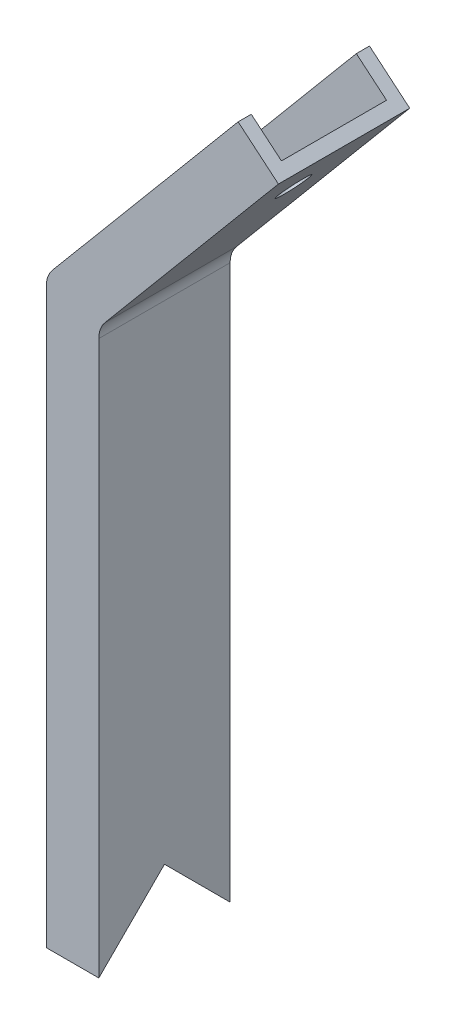
ISO-10303-21;
HEADER;
FILE_DESCRIPTION(('STEP AP214'),'2;1');
FILE_NAME('part.step','',(''),(''),'','','');
FILE_SCHEMA(('AUTOMOTIVE_DESIGN { 1 0 10303 214 1 1 1 1 }'));
ENDSEC;
DATA;
#1=APPLICATION_CONTEXT('core data for automotive mechanical design processes');
#2=APPLICATION_PROTOCOL_DEFINITION('international standard','automotive_design',2000,#1);
#3=PRODUCT_CONTEXT('',#1,'mechanical');
#4=PRODUCT('Part','Part','',(#3));
#5=PRODUCT_RELATED_PRODUCT_CATEGORY('part','',(#4));
#6=PRODUCT_DEFINITION_FORMATION('','',#4);
#7=PRODUCT_DEFINITION_CONTEXT('part definition',#1,'design');
#8=PRODUCT_DEFINITION('design','',#6,#7);
#9=PRODUCT_DEFINITION_SHAPE('','',#8);
#10=(LENGTH_UNIT() NAMED_UNIT(*) SI_UNIT(.MILLI.,.METRE.));
#11=(NAMED_UNIT(*) PLANE_ANGLE_UNIT() SI_UNIT($,.RADIAN.));
#12=(NAMED_UNIT(*) SI_UNIT($,.STERADIAN.) SOLID_ANGLE_UNIT());
#13=UNCERTAINTY_MEASURE_WITH_UNIT(LENGTH_MEASURE(1.E-05),#10,'distance_accuracy_value','');
#14=(GEOMETRIC_REPRESENTATION_CONTEXT(3) GLOBAL_UNCERTAINTY_ASSIGNED_CONTEXT((#13)) GLOBAL_UNIT_ASSIGNED_CONTEXT((#10,
#11,#12)) REPRESENTATION_CONTEXT('',''));
#15=CARTESIAN_POINT('',(0.,0.,0.));
#16=DIRECTION('',(0.,0.,1.));
#17=DIRECTION('',(1.,0.,0.));
#18=AXIS2_PLACEMENT_3D('',#15,#16,#17);
#19=CARTESIAN_POINT('',(-10.,94.6716433746031,50.));
#20=DIRECTION('',(0.766044443118977,-0.64278760968654,0.));
#21=DIRECTION('',(0.64278760968654,0.766044443118977,0.));
#22=AXIS2_PLACEMENT_3D('',#19,#20,#21);
#23=PLANE('',#22);
#24=DIRECTION('',(-0.64278760968654,-0.766044443118977,0.));
#25=VECTOR('',#24,1.);
#26=CARTESIAN_POINT('',(32.8662502431472,145.757651102916,45.));
#27=LINE('',#26,#25);
#28=CARTESIAN_POINT('',(63.0461926343297,181.724705871894,45.));
#29=VERTEX_POINT('',#28);
#30=CARTESIAN_POINT('',(-7.6604444311898,97.4598171288064,45.));
#31=VERTEX_POINT('',#30);
#32=EDGE_CURVE('E287',#29,#31,#27,.T.);
#33=ORIENTED_EDGE('',*,*,#32,.T.);
#34=DIRECTION('',(0.,0.,-1.));
#35=VECTOR('',#34,1.);
#36=CARTESIAN_POINT('',(-7.66044443118978,97.4598171288064,50.));
#37=LINE('',#36,#35);
#38=CARTESIAN_POINT('',(-7.66044443118978,97.4598171288064,50.));
#39=VERTEX_POINT('',#38);
#40=EDGE_CURVE('E230',#31,#39,#37,.F.);
#41=ORIENTED_EDGE('',*,*,#40,.T.);
#42=DIRECTION('',(-0.64278760968654,-0.766044443118977,0.));
#43=VECTOR('',#42,1.);
#44=CARTESIAN_POINT('',(-10.,94.6716433746031,50.));
#45=LINE('',#44,#43);
#46=CARTESIAN_POINT('',(63.0461926343297,181.724705871894,50.));
#47=VERTEX_POINT('',#46);
#48=EDGE_CURVE('E197',#47,#39,#45,.T.);
#49=ORIENTED_EDGE('',*,*,#48,.F.);
#50=DIRECTION('',(0.,0.,-1.));
#51=VECTOR('',#50,1.);
#52=CARTESIAN_POINT('',(63.0461926343297,181.724705871894,50.));
#53=LINE('',#52,#51);
#54=EDGE_CURVE('E210',#47,#29,#53,.T.);
#55=ORIENTED_EDGE('',*,*,#54,.T.);
#56=EDGE_LOOP('',(#33,#41,#49,#55));
#57=FACE_BOUND('',#56,.T.);
#58=ADVANCED_FACE('F42',(#57),#23,.F.);
#59=DIRECTION('',(-0.64278760968654,-0.766044443118977,0.));
#60=VECTOR('',#59,1.);
#61=CARTESIAN_POINT('',(-10.,94.6716433746031,0.));
#62=LINE('',#61,#60);
#63=CARTESIAN_POINT('',(63.0461926343297,181.724705871894,0.));
#64=VERTEX_POINT('',#63);
#65=CARTESIAN_POINT('',(-7.66044443118978,97.4598171288064,0.));
#66=VERTEX_POINT('',#65);
#67=EDGE_CURVE('E190',#64,#66,#62,.T.);
#68=ORIENTED_EDGE('',*,*,#67,.T.);
#69=DIRECTION('',(0.,0.,-1.));
#70=VECTOR('',#69,1.);
#71=CARTESIAN_POINT('',(-7.66044443118978,97.4598171288064,50.));
#72=LINE('',#71,#70);
#73=CARTESIAN_POINT('',(-7.66044443118979,97.4598171288064,5.00000000000001));
#74=VERTEX_POINT('',#73);
#75=EDGE_CURVE('E65',#66,#74,#72,.F.);
#76=ORIENTED_EDGE('',*,*,#75,.T.);
#77=DIRECTION('',(0.64278760968654,0.766044443118977,0.));
#78=VECTOR('',#77,1.);
#79=CARTESIAN_POINT('',(39.0638889106452,153.143709250508,5.00000000000001));
#80=LINE('',#79,#78);
#81=CARTESIAN_POINT('',(63.0461926343297,181.724705871894,5.));
#82=VERTEX_POINT('',#81);
#83=EDGE_CURVE('E264',#74,#82,#80,.T.);
#84=ORIENTED_EDGE('',*,*,#83,.T.);
#85=EDGE_CURVE('E201',#82,#64,#53,.T.);
#86=ORIENTED_EDGE('',*,*,#85,.T.);
#87=EDGE_LOOP('',(#68,#76,#84,#86));
#88=FACE_BOUND('',#87,.T.);
#89=ADVANCED_FACE('F354',(#88),#23,.F.);
#90=CARTESIAN_POINT('',(78.3670814967092,168.868953678163,50.));
#91=DIRECTION('',(-0.642787609686541,-0.766044443118977,0.));
#92=DIRECTION('',(0.766044443118977,-0.642787609686541,0.));
#93=AXIS2_PLACEMENT_3D('',#90,#91,#92);
#94=PLANE('',#93);
#95=DIRECTION('',(-0.766044443118977,0.642787609686541,0.));
#96=VECTOR('',#95,1.);
#97=CARTESIAN_POINT('',(74.5368592811144,172.082891726596,45.));
#98=LINE('',#97,#96);
#99=CARTESIAN_POINT('',(74.5368592811144,172.082891726596,45.));
#100=VERTEX_POINT('',#99);
#101=EDGE_CURVE('E295',#100,#29,#98,.T.);
#102=ORIENTED_EDGE('',*,*,#101,.T.);
#103=ORIENTED_EDGE('',*,*,#54,.F.);
#104=DIRECTION('',(-0.766044443118977,0.642787609686541,0.));
#105=VECTOR('',#104,1.);
#106=CARTESIAN_POINT('',(78.3670814967092,168.868953678163,50.));
#107=LINE('',#106,#105);
#108=CARTESIAN_POINT('',(78.3670814967092,168.868953678163,50.));
#109=VERTEX_POINT('',#108);
#110=EDGE_CURVE('E187',#109,#47,#107,.T.);
#111=ORIENTED_EDGE('',*,*,#110,.F.);
#112=DIRECTION('',(0.,0.,-1.));
#113=VECTOR('',#112,1.);
#114=CARTESIAN_POINT('',(78.3670814967092,168.868953678163,50.));
#115=LINE('',#114,#113);
#116=CARTESIAN_POINT('',(78.3670814967092,168.868953678163,0.));
#117=VERTEX_POINT('',#116);
#118=EDGE_CURVE('E213',#109,#117,#115,.T.);
#119=ORIENTED_EDGE('',*,*,#118,.T.);
#120=DIRECTION('',(-0.766044443118977,0.642787609686541,0.));
#121=VECTOR('',#120,1.);
#122=CARTESIAN_POINT('',(78.3670814967092,168.868953678163,0.));
#123=LINE('',#122,#121);
#124=EDGE_CURVE('E206',#117,#64,#123,.T.);
#125=ORIENTED_EDGE('',*,*,#124,.T.);
#126=ORIENTED_EDGE('',*,*,#85,.F.);
#127=DIRECTION('',(0.766044443118977,-0.642787609686541,0.));
#128=VECTOR('',#127,1.);
#129=CARTESIAN_POINT('',(63.0461926343297,181.724705871894,5.));
#130=LINE('',#129,#128);
#131=CARTESIAN_POINT('',(74.5368592811144,172.082891726596,5.));
#132=VERTEX_POINT('',#131);
#133=EDGE_CURVE('E293',#82,#132,#130,.T.);
#134=ORIENTED_EDGE('',*,*,#133,.T.);
#135=DIRECTION('',(0.,0.,1.));
#136=VECTOR('',#135,1.);
#137=CARTESIAN_POINT('',(74.5368592811144,172.082891726596,5.));
#138=LINE('',#137,#136);
#139=EDGE_CURVE('E262',#132,#100,#138,.T.);
#140=ORIENTED_EDGE('',*,*,#139,.T.);
#141=EDGE_LOOP('',(#102,#103,#111,#119,#125,#126,#134,#140));
#142=FACE_BOUND('',#141,.T.);
#143=ADVANCED_FACE('F334',(#142),#94,.F.);
#144=CARTESIAN_POINT('',(5.,181.726705871894,45.));
#145=DIRECTION('',(-1.,0.,0.));
#146=DIRECTION('',(0.,0.,1.));
#147=AXIS2_PLACEMENT_3D('',#144,#145,#146);
#148=PLANE('',#147);
#149=DIRECTION('',(0.,-0.707106781186516,-0.707106781186579));
#150=VECTOR('',#149,1.);
#151=CARTESIAN_POINT('',(4.99999999999998,49.8224776861849,176.904228185697));
#152=LINE('',#151,#150);
#153=CARTESIAN_POINT('',(5.,-102.081750499499,25.));
#154=VERTEX_POINT('',#153);
#155=CARTESIAN_POINT('',(5.,-122.081750499497,5.00000000000001));
#156=VERTEX_POINT('',#155);
#157=EDGE_CURVE('E304',#154,#156,#152,.T.);
#158=ORIENTED_EDGE('',*,*,#157,.F.);
#159=DIRECTION('',(0.,0.70710678118667,-0.707106781186425));
#160=VECTOR('',#159,1.);
#161=CARTESIAN_POINT('',(5.00000000000002,29.8224776862469,-106.9042281857));
#162=LINE('',#161,#160);
#163=CARTESIAN_POINT('',(5.,-122.081750499505,45.));
#164=VERTEX_POINT('',#163);
#165=EDGE_CURVE('E279',#164,#154,#162,.T.);
#166=ORIENTED_EDGE('',*,*,#165,.F.);
#167=DIRECTION('',(0.,-1.,0.));
#168=VECTOR('',#167,1.);
#169=CARTESIAN_POINT('',(5.,181.726705871894,45.));
#170=LINE('',#169,#168);
#171=CARTESIAN_POINT('',(5.,85.572387517948,45.));
#172=VERTEX_POINT('',#171);
#173=EDGE_CURVE('E273',#172,#164,#170,.T.);
#174=ORIENTED_EDGE('',*,*,#173,.F.);
#175=DIRECTION('',(0.,0.,-1.));
#176=VECTOR('',#175,1.);
#177=CARTESIAN_POINT('',(5.,85.572387517948,45.));
#178=LINE('',#177,#176);
#179=CARTESIAN_POINT('',(5.,85.572387517948,5.00000000000001));
#180=VERTEX_POINT('',#179);
#181=EDGE_CURVE('E220',#172,#180,#178,.T.);
#182=ORIENTED_EDGE('',*,*,#181,.T.);
#183=DIRECTION('',(0.,-1.,0.));
#184=VECTOR('',#183,1.);
#185=CARTESIAN_POINT('',(5.,181.726705871894,5.00000000000001));
#186=LINE('',#185,#184);
#187=EDGE_CURVE('E193',#180,#156,#186,.T.);
#188=ORIENTED_EDGE('',*,*,#187,.T.);
#189=EDGE_LOOP('',(#158,#166,#174,#182,#188));
#190=FACE_BOUND('',#189,.T.);
#191=ADVANCED_FACE('F278',(#190),#148,.T.);
#192=CARTESIAN_POINT('',(-10.,-141.968058968059,50.));
#193=DIRECTION('',(1.,0.,0.));
#194=DIRECTION('',(0.,0.,-1.));
#195=AXIS2_PLACEMENT_3D('',#192,#193,#194);
#196=PLANE('',#195);
#197=DIRECTION('',(0.,-1.,0.));
#198=VECTOR('',#197,1.);
#199=CARTESIAN_POINT('',(-10.,-141.968058968059,0.));
#200=LINE('',#199,#198);
#201=CARTESIAN_POINT('',(-10.,91.031941031941,0.));
#202=VERTEX_POINT('',#201);
#203=CARTESIAN_POINT('',(-10.,-127.081750499496,0.));
#204=VERTEX_POINT('',#203);
#205=EDGE_CURVE('E185',#202,#204,#200,.T.);
#206=ORIENTED_EDGE('',*,*,#205,.T.);
#207=DIRECTION('',(0.,-0.707106781186516,-0.707106781186579));
#208=VECTOR('',#207,1.);
#209=CARTESIAN_POINT('',(-10.,-102.081750499499,25.));
#210=LINE('',#209,#208);
#211=CARTESIAN_POINT('',(-10.,-122.081750499497,5.00000000000001));
#212=VERTEX_POINT('',#211);
#213=EDGE_CURVE('E170',#212,#204,#210,.T.);
#214=ORIENTED_EDGE('',*,*,#213,.F.);
#215=DIRECTION('',(0.,-1.,0.));
#216=VECTOR('',#215,1.);
#217=CARTESIAN_POINT('',(-10.,181.726705871894,5.));
#218=LINE('',#217,#216);
#219=CARTESIAN_POINT('',(-10.,91.031941031941,5.));
#220=VERTEX_POINT('',#219);
#221=EDGE_CURVE('E282',#220,#212,#218,.T.);
#222=ORIENTED_EDGE('',*,*,#221,.F.);
#223=DIRECTION('',(0.,0.,-1.));
#224=VECTOR('',#223,1.);
#225=CARTESIAN_POINT('',(-10.,91.031941031941,50.));
#226=LINE('',#225,#224);
#227=EDGE_CURVE('E234',#220,#202,#226,.T.);
#228=ORIENTED_EDGE('',*,*,#227,.T.);
#229=EDGE_LOOP('',(#206,#214,#222,#228));
#230=FACE_BOUND('',#229,.T.);
#231=ADVANCED_FACE('F351',(#230),#196,.F.);
#232=DIRECTION('',(0.,-1.,0.));
#233=VECTOR('',#232,1.);
#234=CARTESIAN_POINT('',(-10.,181.726705871894,45.));
#235=LINE('',#234,#233);
#236=CARTESIAN_POINT('',(-10.,91.031941031941,45.));
#237=VERTEX_POINT('',#236);
#238=CARTESIAN_POINT('',(-10.,-122.081750499505,45.));
#239=VERTEX_POINT('',#238);
#240=EDGE_CURVE('E280',#237,#239,#235,.T.);
#241=ORIENTED_EDGE('',*,*,#240,.T.);
#242=DIRECTION('',(0.,0.70710678118667,-0.707106781186425));
#243=VECTOR('',#242,1.);
#244=CARTESIAN_POINT('',(-10.,-127.081750499507,50.));
#245=LINE('',#244,#243);
#246=CARTESIAN_POINT('',(-10.,-127.081750499507,50.));
#247=VERTEX_POINT('',#246);
#248=EDGE_CURVE('E57',#247,#239,#245,.T.);
#249=ORIENTED_EDGE('',*,*,#248,.F.);
#250=DIRECTION('',(0.,-1.,0.));
#251=VECTOR('',#250,1.);
#252=CARTESIAN_POINT('',(-10.,-141.968058968059,50.));
#253=LINE('',#252,#251);
#254=CARTESIAN_POINT('',(-10.,91.031941031941,50.));
#255=VERTEX_POINT('',#254);
#256=EDGE_CURVE('E178',#255,#247,#253,.T.);
#257=ORIENTED_EDGE('',*,*,#256,.F.);
#258=DIRECTION('',(0.,0.,-1.));
#259=VECTOR('',#258,1.);
#260=CARTESIAN_POINT('',(-10.,91.031941031941,50.));
#261=LINE('',#260,#259);
#262=EDGE_CURVE('E225',#255,#237,#261,.T.);
#263=ORIENTED_EDGE('',*,*,#262,.T.);
#264=EDGE_LOOP('',(#241,#249,#257,#263));
#265=FACE_BOUND('',#264,.T.);
#266=ADVANCED_FACE('F344',(#265),#196,.F.);
#267=CARTESIAN_POINT('',(10.,-141.968058968059,50.));
#268=DIRECTION('',(-1.,0.,0.));
#269=DIRECTION('',(0.,0.,1.));
#270=AXIS2_PLACEMENT_3D('',#267,#268,#269);
#271=PLANE('',#270);
#272=DIRECTION('',(0.,0.70710678118667,-0.707106781186425));
#273=VECTOR('',#272,1.);
#274=CARTESIAN_POINT('',(10.,-127.081750499507,50.));
#275=LINE('',#274,#273);
#276=CARTESIAN_POINT('',(10.,-127.081750499507,50.));
#277=VERTEX_POINT('',#276);
#278=CARTESIAN_POINT('',(10.,-102.081750499499,25.));
#279=VERTEX_POINT('',#278);
#280=EDGE_CURVE('E159',#277,#279,#275,.T.);
#281=ORIENTED_EDGE('',*,*,#280,.T.);
#282=DIRECTION('',(0.,-0.707106781186516,-0.707106781186579));
#283=VECTOR('',#282,1.);
#284=CARTESIAN_POINT('',(10.,-102.081750499499,25.));
#285=LINE('',#284,#283);
#286=CARTESIAN_POINT('',(10.,-127.081750499496,0.));
#287=VERTEX_POINT('',#286);
#288=EDGE_CURVE('E169',#279,#287,#285,.T.);
#289=ORIENTED_EDGE('',*,*,#288,.T.);
#290=DIRECTION('',(0.,1.,0.));
#291=VECTOR('',#290,1.);
#292=CARTESIAN_POINT('',(10.,-141.968058968059,0.));
#293=LINE('',#292,#291);
#294=CARTESIAN_POINT('',(10.,83.7525363466169,0.));
#295=VERTEX_POINT('',#294);
#296=EDGE_CURVE('E202',#287,#295,#293,.T.);
#297=ORIENTED_EDGE('',*,*,#296,.T.);
#298=DIRECTION('',(0.,0.,-1.));
#299=VECTOR('',#298,1.);
#300=CARTESIAN_POINT('',(10.,83.752536346617,50.));
#301=LINE('',#300,#299);
#302=CARTESIAN_POINT('',(10.,83.7525363466169,50.));
#303=VERTEX_POINT('',#302);
#304=EDGE_CURVE('E182',#295,#303,#301,.F.);
#305=ORIENTED_EDGE('',*,*,#304,.T.);
#306=DIRECTION('',(0.,1.,0.));
#307=VECTOR('',#306,1.);
#308=CARTESIAN_POINT('',(10.,-141.968058968059,50.));
#309=LINE('',#308,#307);
#310=EDGE_CURVE('E175',#277,#303,#309,.T.);
#311=ORIENTED_EDGE('',*,*,#310,.F.);
#312=EDGE_LOOP('',(#281,#289,#297,#305,#311));
#313=FACE_BOUND('',#312,.T.);
#314=ADVANCED_FACE('F180',(#313),#271,.F.);
#315=CARTESIAN_POINT('',(10.,87.392238689279,50.));
#316=DIRECTION('',(-0.766044443118977,0.64278760968654,0.));
#317=DIRECTION('',(-0.64278760968654,-0.766044443118977,0.));
#318=AXIS2_PLACEMENT_3D('',#315,#316,#317);
#319=PLANE('',#318);
#320=CARTESIAN_POINT('',(59.083453206113,145.887620384594,25.));
#321=DIRECTION('',(-0.766044443118977,0.64278760968654,0.));
#322=DIRECTION('',(-0.64278760968654,-0.766044443118977,0.));
#323=AXIS2_PLACEMENT_3D('',#320,#321,#322);
#324=CIRCLE('',#323,6.00000000000001);
#325=CARTESIAN_POINT('',(55.2267275479938,141.29135372588,25.));
#326=VERTEX_POINT('',#325);
#327=EDGE_CURVE('E298',#326,#326,#324,.F.);
#328=ORIENTED_EDGE('',*,*,#327,.F.);
#329=EDGE_LOOP('',(#328));
#330=FACE_BOUND('',#329,.T.);
#331=DIRECTION('',(0.64278760968654,0.766044443118977,0.));
#332=VECTOR('',#331,1.);
#333=CARTESIAN_POINT('',(10.,87.392238689279,50.));
#334=LINE('',#333,#332);
#335=CARTESIAN_POINT('',(12.3395555688102,90.1804124434824,50.));
#336=VERTEX_POINT('',#335);
#337=EDGE_CURVE('E184',#336,#109,#334,.T.);
#338=ORIENTED_EDGE('',*,*,#337,.F.);
#339=DIRECTION('',(0.,0.,-1.));
#340=VECTOR('',#339,1.);
#341=CARTESIAN_POINT('',(12.3395555688102,90.1804124434824,0.));
#342=LINE('',#341,#340);
#343=CARTESIAN_POINT('',(12.3395555688102,90.1804124434824,0.));
#344=VERTEX_POINT('',#343);
#345=EDGE_CURVE('E216',#336,#344,#342,.T.);
#346=ORIENTED_EDGE('',*,*,#345,.T.);
#347=DIRECTION('',(0.64278760968654,0.766044443118977,0.));
#348=VECTOR('',#347,1.);
#349=CARTESIAN_POINT('',(10.,87.392238689279,0.));
#350=LINE('',#349,#348);
#351=EDGE_CURVE('E204',#344,#117,#350,.T.);
#352=ORIENTED_EDGE('',*,*,#351,.T.);
#353=ORIENTED_EDGE('',*,*,#118,.F.);
#354=EDGE_LOOP('',(#338,#346,#352,#353));
#355=FACE_BOUND('',#354,.T.);
#356=ADVANCED_FACE('F330',(#330,#355),#319,.F.);
#357=CARTESIAN_POINT('',(0.,0.,50.));
#358=DIRECTION('',(0.,0.,-1.));
#359=DIRECTION('',(-1.,0.,0.));
#360=AXIS2_PLACEMENT_3D('',#357,#358,#359);
#361=PLANE('',#360);
#362=ORIENTED_EDGE('',*,*,#256,.T.);
#363=DIRECTION('',(-1.,0.,0.));
#364=VECTOR('',#363,1.);
#365=CARTESIAN_POINT('',(10.,-127.081750499507,50.));
#366=LINE('',#365,#364);
#367=EDGE_CURVE('E162',#277,#247,#366,.T.);
#368=ORIENTED_EDGE('',*,*,#367,.F.);
#369=ORIENTED_EDGE('',*,*,#310,.T.);
#370=CARTESIAN_POINT('',(20.,83.752536346617,50.));
#371=DIRECTION('',(0.,0.,-1.));
#372=DIRECTION('',(-1.,0.,0.));
#373=AXIS2_PLACEMENT_3D('',#370,#371,#372);
#374=CIRCLE('',#373,10.);
#375=EDGE_CURVE('E245',#303,#336,#374,.T.);
#376=ORIENTED_EDGE('',*,*,#375,.T.);
#377=ORIENTED_EDGE('',*,*,#337,.T.);
#378=ORIENTED_EDGE('',*,*,#110,.T.);
#379=ORIENTED_EDGE('',*,*,#48,.T.);
#380=CARTESIAN_POINT('',(0.,91.031941031941,50.));
#381=DIRECTION('',(0.,0.,-1.));
#382=DIRECTION('',(-1.,0.,0.));
#383=AXIS2_PLACEMENT_3D('',#380,#381,#382);
#384=CIRCLE('',#383,10.);
#385=EDGE_CURVE('E232',#39,#255,#384,.F.);
#386=ORIENTED_EDGE('',*,*,#385,.T.);
#387=EDGE_LOOP('',(#362,#368,#369,#376,#377,#378,#379,#386));
#388=FACE_BOUND('',#387,.T.);
#389=ADVANCED_FACE('F174',(#388),#361,.F.);
#390=CARTESIAN_POINT('',(0.,0.,0.));
#391=DIRECTION('',(0.,0.,-1.));
#392=DIRECTION('',(-1.,0.,0.));
#393=AXIS2_PLACEMENT_3D('',#390,#391,#392);
#394=PLANE('',#393);
#395=DIRECTION('',(-1.,0.,0.));
#396=VECTOR('',#395,1.);
#397=CARTESIAN_POINT('',(10.,-127.081750499496,0.));
#398=LINE('',#397,#396);
#399=EDGE_CURVE('E310',#287,#204,#398,.T.);
#400=ORIENTED_EDGE('',*,*,#399,.T.);
#401=ORIENTED_EDGE('',*,*,#205,.F.);
#402=CARTESIAN_POINT('',(0.,91.031941031941,0.));
#403=DIRECTION('',(0.,0.,-1.));
#404=DIRECTION('',(-1.,0.,0.));
#405=AXIS2_PLACEMENT_3D('',#402,#403,#404);
#406=CIRCLE('',#405,10.);
#407=EDGE_CURVE('E237',#202,#66,#406,.T.);
#408=ORIENTED_EDGE('',*,*,#407,.T.);
#409=ORIENTED_EDGE('',*,*,#67,.F.);
#410=ORIENTED_EDGE('',*,*,#124,.F.);
#411=ORIENTED_EDGE('',*,*,#351,.F.);
#412=CARTESIAN_POINT('',(20.,83.752536346617,0.));
#413=DIRECTION('',(0.,0.,-1.));
#414=DIRECTION('',(-1.,0.,0.));
#415=AXIS2_PLACEMENT_3D('',#412,#413,#414);
#416=CIRCLE('',#415,10.);
#417=EDGE_CURVE('E242',#344,#295,#416,.F.);
#418=ORIENTED_EDGE('',*,*,#417,.T.);
#419=ORIENTED_EDGE('',*,*,#296,.F.);
#420=EDGE_LOOP('',(#400,#401,#408,#409,#410,#411,#418,#419));
#421=FACE_BOUND('',#420,.T.);
#422=ADVANCED_FACE('F320',(#421),#394,.T.);
#423=CARTESIAN_POINT('',(5.,181.726705871894,5.00000000000001));
#424=DIRECTION('',(0.,0.,1.));
#425=DIRECTION('',(1.,0.,0.));
#426=AXIS2_PLACEMENT_3D('',#423,#424,#425);
#427=PLANE('',#426);
#428=DIRECTION('',(-1.,0.,0.));
#429=VECTOR('',#428,1.);
#430=CARTESIAN_POINT('',(5.00000000000004,-122.081750499497,5.00000000000001));
#431=LINE('',#430,#429);
#432=EDGE_CURVE('E306',#156,#212,#431,.T.);
#433=ORIENTED_EDGE('',*,*,#432,.F.);
#434=ORIENTED_EDGE('',*,*,#187,.F.);
#435=CARTESIAN_POINT('',(15.,85.572387517948,5.));
#436=DIRECTION('',(0.,0.,1.));
#437=DIRECTION('',(1.,0.,0.));
#438=AXIS2_PLACEMENT_3D('',#435,#436,#437);
#439=CIRCLE('',#438,10.);
#440=CARTESIAN_POINT('',(7.33955556881024,92.0002636148134,5.));
#441=VERTEX_POINT('',#440);
#442=EDGE_CURVE('E50',#180,#441,#439,.F.);
#443=ORIENTED_EDGE('',*,*,#442,.T.);
#444=DIRECTION('',(0.642787609686541,0.766044443118977,0.));
#445=VECTOR('',#444,1.);
#446=CARTESIAN_POINT('',(1.4906666467846,85.029829229305,5.));
#447=LINE('',#446,#445);
#448=EDGE_CURVE('E252',#441,#132,#447,.T.);
#449=ORIENTED_EDGE('',*,*,#448,.T.);
#450=ORIENTED_EDGE('',*,*,#133,.F.);
#451=ORIENTED_EDGE('',*,*,#83,.F.);
#452=CARTESIAN_POINT('',(0.,91.031941031941,5.));
#453=DIRECTION('',(0.,0.,1.));
#454=DIRECTION('',(1.,0.,0.));
#455=AXIS2_PLACEMENT_3D('',#452,#453,#454);
#456=CIRCLE('',#455,10.);
#457=EDGE_CURVE('E240',#74,#220,#456,.T.);
#458=ORIENTED_EDGE('',*,*,#457,.T.);
#459=ORIENTED_EDGE('',*,*,#221,.T.);
#460=EDGE_LOOP('',(#433,#434,#443,#449,#450,#451,#458,#459));
#461=FACE_BOUND('',#460,.T.);
#462=ADVANCED_FACE('F250',(#461),#427,.T.);
#463=CARTESIAN_POINT('',(-10.,181.726705871894,45.));
#464=DIRECTION('',(0.,0.,-1.));
#465=DIRECTION('',(-1.,0.,0.));
#466=AXIS2_PLACEMENT_3D('',#463,#464,#465);
#467=PLANE('',#466);
#468=DIRECTION('',(1.,0.,0.));
#469=VECTOR('',#468,1.);
#470=CARTESIAN_POINT('',(-10.,-122.081750499505,45.));
#471=LINE('',#470,#469);
#472=EDGE_CURVE('E309',#239,#164,#471,.T.);
#473=ORIENTED_EDGE('',*,*,#472,.F.);
#474=ORIENTED_EDGE('',*,*,#240,.F.);
#475=CARTESIAN_POINT('',(0.,91.031941031941,45.));
#476=DIRECTION('',(0.,0.,-1.));
#477=DIRECTION('',(-1.,0.,0.));
#478=AXIS2_PLACEMENT_3D('',#475,#476,#477);
#479=CIRCLE('',#478,10.);
#480=EDGE_CURVE('E228',#237,#31,#479,.T.);
#481=ORIENTED_EDGE('',*,*,#480,.T.);
#482=ORIENTED_EDGE('',*,*,#32,.F.);
#483=ORIENTED_EDGE('',*,*,#101,.F.);
#484=DIRECTION('',(0.642787609686541,0.766044443118977,0.));
#485=VECTOR('',#484,1.);
#486=CARTESIAN_POINT('',(1.4906666467846,85.029829229305,45.));
#487=LINE('',#486,#485);
#488=CARTESIAN_POINT('',(7.33955556881023,92.0002636148134,45.));
#489=VERTEX_POINT('',#488);
#490=EDGE_CURVE('E265',#489,#100,#487,.T.);
#491=ORIENTED_EDGE('',*,*,#490,.F.);
#492=CARTESIAN_POINT('',(15.,85.572387517948,45.));
#493=DIRECTION('',(0.,0.,-1.));
#494=DIRECTION('',(-1.,0.,0.));
#495=AXIS2_PLACEMENT_3D('',#492,#493,#494);
#496=CIRCLE('',#495,10.);
#497=EDGE_CURVE('E11',#489,#172,#496,.F.);
#498=ORIENTED_EDGE('',*,*,#497,.T.);
#499=ORIENTED_EDGE('',*,*,#173,.T.);
#500=EDGE_LOOP('',(#473,#474,#481,#482,#483,#491,#498,#499));
#501=FACE_BOUND('',#500,.T.);
#502=ADVANCED_FACE('F272',(#501),#467,.T.);
#503=CARTESIAN_POINT('',(1.4906666467846,85.029829229305,5.));
#504=DIRECTION('',(-0.766044443118977,0.642787609686541,0.));
#505=DIRECTION('',(-0.642787609686541,-0.766044443118977,0.));
#506=AXIS2_PLACEMENT_3D('',#503,#504,#505);
#507=PLANE('',#506);
#508=CARTESIAN_POINT('',(55.2532309905182,149.101558433027,25.));
#509=DIRECTION('',(-0.766044443118977,0.642787609686541,0.));
#510=DIRECTION('',(-0.642787609686541,-0.766044443118977,0.));
#511=AXIS2_PLACEMENT_3D('',#508,#509,#510);
#512=CIRCLE('',#511,6.00000000000001);
#513=CARTESIAN_POINT('',(51.3965053323989,144.505291774313,25.));
#514=VERTEX_POINT('',#513);
#515=EDGE_CURVE('E301',#514,#514,#512,.T.);
#516=ORIENTED_EDGE('',*,*,#515,.F.);
#517=EDGE_LOOP('',(#516));
#518=FACE_BOUND('',#517,.T.);
#519=ORIENTED_EDGE('',*,*,#448,.F.);
#520=DIRECTION('',(0.,0.,-1.));
#521=VECTOR('',#520,1.);
#522=CARTESIAN_POINT('',(7.33955556881024,92.0002636148134,5.));
#523=LINE('',#522,#521);
#524=EDGE_CURVE('E223',#441,#489,#523,.F.);
#525=ORIENTED_EDGE('',*,*,#524,.T.);
#526=ORIENTED_EDGE('',*,*,#490,.T.);
#527=ORIENTED_EDGE('',*,*,#139,.F.);
#528=EDGE_LOOP('',(#519,#525,#526,#527));
#529=FACE_BOUND('',#528,.T.);
#530=ADVANCED_FACE('F259',(#518,#529),#507,.T.);
#531=CARTESIAN_POINT('',(20.,83.752536346617,50.));
#532=DIRECTION('',(0.,0.,1.));
#533=DIRECTION('',(1.,0.,0.));
#534=AXIS2_PLACEMENT_3D('',#531,#532,#533);
#535=CYLINDRICAL_SURFACE('',#534,10.);
#536=ORIENTED_EDGE('',*,*,#375,.F.);
#537=ORIENTED_EDGE('',*,*,#304,.F.);
#538=ORIENTED_EDGE('',*,*,#417,.F.);
#539=ORIENTED_EDGE('',*,*,#345,.F.);
#540=EDGE_LOOP('',(#536,#537,#538,#539));
#541=FACE_BOUND('',#540,.T.);
#542=ADVANCED_FACE('F326',(#541),#535,.F.);
#543=CARTESIAN_POINT('',(15.,85.572387517948,45.));
#544=DIRECTION('',(0.,0.,-1.));
#545=DIRECTION('',(0.,1.,0.));
#546=AXIS2_PLACEMENT_3D('',#543,#544,#545);
#547=CYLINDRICAL_SURFACE('',#546,10.);
#548=ORIENTED_EDGE('',*,*,#497,.F.);
#549=ORIENTED_EDGE('',*,*,#524,.F.);
#550=ORIENTED_EDGE('',*,*,#442,.F.);
#551=ORIENTED_EDGE('',*,*,#181,.F.);
#552=EDGE_LOOP('',(#548,#549,#550,#551));
#553=FACE_BOUND('',#552,.T.);
#554=ADVANCED_FACE('F268',(#553),#547,.T.);
#555=CARTESIAN_POINT('',(0.,91.031941031941,50.));
#556=DIRECTION('',(0.,0.,-1.));
#557=DIRECTION('',(-1.,0.,0.));
#558=AXIS2_PLACEMENT_3D('',#555,#556,#557);
#559=CYLINDRICAL_SURFACE('',#558,10.);
#560=ORIENTED_EDGE('',*,*,#385,.F.);
#561=ORIENTED_EDGE('',*,*,#40,.F.);
#562=ORIENTED_EDGE('',*,*,#480,.F.);
#563=ORIENTED_EDGE('',*,*,#262,.F.);
#564=EDGE_LOOP('',(#560,#561,#562,#563));
#565=FACE_BOUND('',#564,.T.);
#566=ADVANCED_FACE('F341',(#565),#559,.T.);
#567=CARTESIAN_POINT('',(0.,91.031941031941,50.));
#568=DIRECTION('',(0.,0.,-1.));
#569=DIRECTION('',(-1.,0.,0.));
#570=AXIS2_PLACEMENT_3D('',#567,#568,#569);
#571=CYLINDRICAL_SURFACE('',#570,10.);
#572=ORIENTED_EDGE('',*,*,#457,.F.);
#573=ORIENTED_EDGE('',*,*,#75,.F.);
#574=ORIENTED_EDGE('',*,*,#407,.F.);
#575=ORIENTED_EDGE('',*,*,#227,.F.);
#576=EDGE_LOOP('',(#572,#573,#574,#575));
#577=FACE_BOUND('',#576,.T.);
#578=ADVANCED_FACE('F44',(#577),#571,.T.);
#579=CARTESIAN_POINT('',(212.141882422655,17.4563488804192,25.));
#580=DIRECTION('',(-0.766044443118977,0.642787609686541,0.));
#581=DIRECTION('',(-0.642787609686541,-0.766044443118977,0.));
#582=AXIS2_PLACEMENT_3D('',#579,#580,#581);
#583=CYLINDRICAL_SURFACE('',#582,6.00000000000001);
#584=ORIENTED_EDGE('',*,*,#515,.T.);
#585=EDGE_LOOP('',(#584));
#586=FACE_BOUND('',#585,.T.);
#587=ORIENTED_EDGE('',*,*,#327,.T.);
#588=EDGE_LOOP('',(#587));
#589=FACE_BOUND('',#588,.T.);
#590=ADVANCED_FACE('F378',(#586,#589),#583,.F.);
#591=CARTESIAN_POINT('',(10.,-102.081750499499,25.));
#592=DIRECTION('',(0.,0.707106781186579,-0.707106781186516));
#593=DIRECTION('',(0.,0.707106781186516,0.707106781186579));
#594=AXIS2_PLACEMENT_3D('',#591,#592,#593);
#595=PLANE('',#594);
#596=ORIENTED_EDGE('',*,*,#157,.T.);
#597=ORIENTED_EDGE('',*,*,#432,.T.);
#598=ORIENTED_EDGE('',*,*,#213,.T.);
#599=ORIENTED_EDGE('',*,*,#399,.F.);
#600=ORIENTED_EDGE('',*,*,#288,.F.);
#601=DIRECTION('',(-1.,0.,0.));
#602=VECTOR('',#601,1.);
#603=CARTESIAN_POINT('',(10.,-102.081750499499,25.));
#604=LINE('',#603,#602);
#605=EDGE_CURVE('E164',#279,#154,#604,.T.);
#606=ORIENTED_EDGE('',*,*,#605,.T.);
#607=EDGE_LOOP('',(#596,#597,#598,#599,#600,#606));
#608=FACE_BOUND('',#607,.T.);
#609=ADVANCED_FACE('F345',(#608),#595,.F.);
#610=CARTESIAN_POINT('',(10.,-127.081750499507,50.));
#611=DIRECTION('',(0.,0.707106781186425,0.70710678118667));
#612=DIRECTION('',(0.,-0.70710678118667,0.707106781186425));
#613=AXIS2_PLACEMENT_3D('',#610,#611,#612);
#614=PLANE('',#613);
#615=ORIENTED_EDGE('',*,*,#165,.T.);
#616=ORIENTED_EDGE('',*,*,#605,.F.);
#617=ORIENTED_EDGE('',*,*,#280,.F.);
#618=ORIENTED_EDGE('',*,*,#367,.T.);
#619=ORIENTED_EDGE('',*,*,#248,.T.);
#620=ORIENTED_EDGE('',*,*,#472,.T.);
#621=EDGE_LOOP('',(#615,#616,#617,#618,#619,#620));
#622=FACE_BOUND('',#621,.T.);
#623=ADVANCED_FACE('F161',(#622),#614,.F.);
#624=CLOSED_SHELL('',(#58,#89,#143,#191,#231,#266,#314,#356,#389,#422,#462,#502,#530,#542,#554,
#566,#578,#590,#609,#623));
#625=MANIFOLD_SOLID_BREP('B2',#624);
#626=ADVANCED_BREP_SHAPE_REPRESENTATION('',(#18,#625),#14);
#627=SHAPE_DEFINITION_REPRESENTATION(#9,#626);
ENDSEC;
END-ISO-10303-21;
